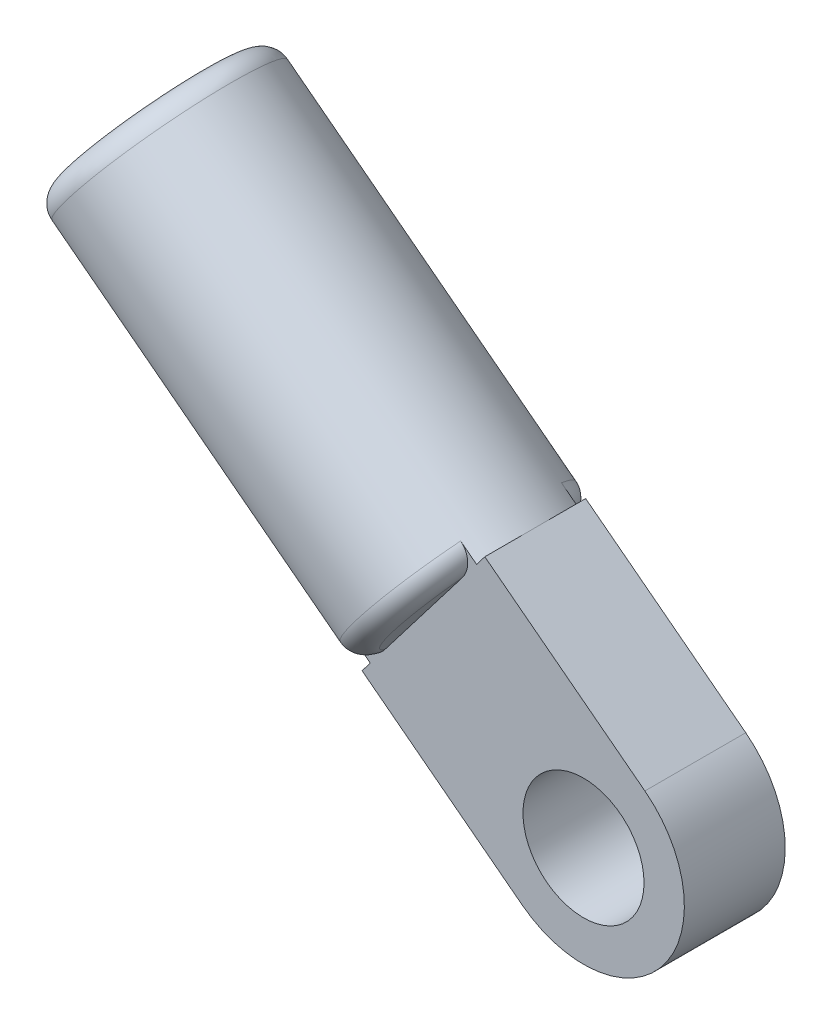
ISO-10303-21;
HEADER;
FILE_DESCRIPTION(('STEP AP214'),'2;1');
FILE_NAME('part.step','',(''),(''),'','','');
FILE_SCHEMA(('AUTOMOTIVE_DESIGN { 1 0 10303 214 1 1 1 1 }'));
ENDSEC;
DATA;
#1=APPLICATION_CONTEXT('core data for automotive mechanical design processes');
#2=APPLICATION_PROTOCOL_DEFINITION('international standard','automotive_design',2000,#1);
#3=PRODUCT_CONTEXT('',#1,'mechanical');
#4=PRODUCT('Part','Part','',(#3));
#5=PRODUCT_RELATED_PRODUCT_CATEGORY('part','',(#4));
#6=PRODUCT_DEFINITION_FORMATION('','',#4);
#7=PRODUCT_DEFINITION_CONTEXT('part definition',#1,'design');
#8=PRODUCT_DEFINITION('design','',#6,#7);
#9=PRODUCT_DEFINITION_SHAPE('','',#8);
#10=(LENGTH_UNIT() NAMED_UNIT(*) SI_UNIT(.MILLI.,.METRE.));
#11=(NAMED_UNIT(*) PLANE_ANGLE_UNIT() SI_UNIT($,.RADIAN.));
#12=(NAMED_UNIT(*) SI_UNIT($,.STERADIAN.) SOLID_ANGLE_UNIT());
#13=UNCERTAINTY_MEASURE_WITH_UNIT(LENGTH_MEASURE(1.E-05),#10,'distance_accuracy_value','');
#14=(GEOMETRIC_REPRESENTATION_CONTEXT(3) GLOBAL_UNCERTAINTY_ASSIGNED_CONTEXT((#13)) GLOBAL_UNIT_ASSIGNED_CONTEXT((#10,
#11,#12)) REPRESENTATION_CONTEXT('',''));
#15=CARTESIAN_POINT('',(0.,0.,0.));
#16=DIRECTION('',(0.,0.,1.));
#17=DIRECTION('',(1.,0.,0.));
#18=AXIS2_PLACEMENT_3D('',#15,#16,#17);
#19=CARTESIAN_POINT('',(-2.23785493034824,30.0086299599503,2.5));
#20=DIRECTION('',(0.793491471983616,-0.608581369982088,0.));
#21=DIRECTION('',(0.608581369982088,0.793491471983616,0.));
#22=AXIS2_PLACEMENT_3D('',#19,#20,#21);
#23=PLANE('',#22);
#24=CARTESIAN_POINT('',(-5.28076178025869,26.0411726000322,0.));
#25=DIRECTION('',(-0.793491471983616,0.608581369982088,0.));
#26=DIRECTION('',(-0.608581369982088,-0.793491471983616,0.));
#27=AXIS2_PLACEMENT_3D('',#24,#25,#26);
#28=CIRCLE('',#27,5.);
#29=CARTESIAN_POINT('',(-2.64552714688657,29.4770914621528,2.5));
#30=VERTEX_POINT('',#29);
#31=CARTESIAN_POINT('',(-2.23785493034825,30.0086299599503,0.));
#32=VERTEX_POINT('',#31);
#33=EDGE_CURVE('E133',#30,#32,#28,.T.);
#34=ORIENTED_EDGE('',*,*,#33,.F.);
#35=DIRECTION('',(-0.608581369982088,-0.793491471983616,0.));
#36=VECTOR('',#35,1.);
#37=CARTESIAN_POINT('',(-2.23785493034824,30.0086299599503,2.5));
#38=LINE('',#37,#36);
#39=CARTESIAN_POINT('',(-2.23785493034824,30.0086299599503,2.5));
#40=VERTEX_POINT('',#39);
#41=EDGE_CURVE('E159',#40,#30,#38,.T.);
#42=ORIENTED_EDGE('',*,*,#41,.F.);
#43=DIRECTION('',(0.,0.,-1.));
#44=VECTOR('',#43,1.);
#45=CARTESIAN_POINT('',(-2.23785493034824,30.0086299599503,2.5));
#46=LINE('',#45,#44);
#47=EDGE_CURVE('E141',#40,#32,#46,.T.);
#48=ORIENTED_EDGE('',*,*,#47,.T.);
#49=EDGE_LOOP('',(#34,#42,#48));
#50=FACE_BOUND('',#49,.T.);
#51=ADVANCED_FACE('F17',(#50),#23,.F.);
#52=CARTESIAN_POINT('',(-2.64552714688657,29.4770914621528,-2.5));
#53=VERTEX_POINT('',#52);
#54=EDGE_CURVE('E138',#32,#53,#28,.T.);
#55=ORIENTED_EDGE('',*,*,#54,.F.);
#56=CARTESIAN_POINT('',(-2.23785493034824,30.0086299599503,-2.5));
#57=VERTEX_POINT('',#56);
#58=EDGE_CURVE('E115',#32,#57,#46,.T.);
#59=ORIENTED_EDGE('',*,*,#58,.T.);
#60=DIRECTION('',(-0.608581369982088,-0.793491471983616,0.));
#61=VECTOR('',#60,1.);
#62=CARTESIAN_POINT('',(-2.23785493034824,30.0086299599503,-2.5));
#63=LINE('',#62,#61);
#64=EDGE_CURVE('E169',#57,#53,#63,.T.);
#65=ORIENTED_EDGE('',*,*,#64,.T.);
#66=EDGE_LOOP('',(#55,#59,#65));
#67=FACE_BOUND('',#66,.T.);
#68=ADVANCED_FACE('F241',(#67),#23,.F.);
#69=CARTESIAN_POINT('',(-8.32366863016913,22.0737152401142,0.));
#70=VERTEX_POINT('',#69);
#71=CARTESIAN_POINT('',(-7.91599641363081,22.6052537379116,2.5));
#72=VERTEX_POINT('',#71);
#73=EDGE_CURVE('E126',#70,#72,#28,.T.);
#74=ORIENTED_EDGE('',*,*,#73,.F.);
#75=DIRECTION('',(0.,0.,-1.));
#76=VECTOR('',#75,1.);
#77=CARTESIAN_POINT('',(-8.32366863016913,22.0737152401141,2.5));
#78=LINE('',#77,#76);
#79=CARTESIAN_POINT('',(-8.32366863016913,22.0737152401141,2.5));
#80=VERTEX_POINT('',#79);
#81=EDGE_CURVE('E105',#80,#70,#78,.T.);
#82=ORIENTED_EDGE('',*,*,#81,.F.);
#83=EDGE_CURVE('E128',#72,#80,#38,.T.);
#84=ORIENTED_EDGE('',*,*,#83,.F.);
#85=EDGE_LOOP('',(#74,#82,#84));
#86=FACE_BOUND('',#85,.T.);
#87=ADVANCED_FACE('F127',(#86),#23,.F.);
#88=CARTESIAN_POINT('',(2.65415293957748,19.9553589002113,2.5));
#89=DIRECTION('',(0.,0.,1.));
#90=DIRECTION('',(1.,0.,0.));
#91=AXIS2_PLACEMENT_3D('',#88,#89,#90);
#92=PLANE('',#91);
#93=CARTESIAN_POINT('',(2.65415293957748,19.9553589002113,2.5));
#94=DIRECTION('',(0.,0.,1.));
#95=DIRECTION('',(1.,0.,0.));
#96=AXIS2_PLACEMENT_3D('',#93,#94,#95);
#97=CIRCLE('',#96,5.);
#98=CARTESIAN_POINT('',(-0.388753910332963,15.9879015402932,2.5));
#99=VERTEX_POINT('',#98);
#100=CARTESIAN_POINT('',(5.69705978948792,23.9228162601294,2.5));
#101=VERTEX_POINT('',#100);
#102=EDGE_CURVE('E153',#99,#101,#97,.T.);
#103=ORIENTED_EDGE('',*,*,#102,.T.);
#104=DIRECTION('',(-0.793491471983616,0.608581369982087,0.));
#105=VECTOR('',#104,1.);
#106=CARTESIAN_POINT('',(5.69705978948792,23.9228162601294,2.5));
#107=LINE('',#106,#105);
#108=EDGE_CURVE('E156',#101,#40,#107,.T.);
#109=ORIENTED_EDGE('',*,*,#108,.T.);
#110=ORIENTED_EDGE('',*,*,#41,.T.);
#111=DIRECTION('',(0.793491471983616,-0.608581369982088,0.));
#112=VECTOR('',#111,1.);
#113=CARTESIAN_POINT('',(-3.43901861887018,30.0856728321349,2.5));
#114=LINE('',#113,#112);
#115=CARTESIAN_POINT('',(-3.43901861887018,30.0856728321349,2.5));
#116=VERTEX_POINT('',#115);
#117=EDGE_CURVE('E188',#116,#30,#114,.T.);
#118=ORIENTED_EDGE('',*,*,#117,.F.);
#119=CARTESIAN_POINT('',(-3.43901861887018,30.0856728321349,2.5));
#120=CARTESIAN_POINT('',(-3.41896955500238,30.0702975440747,2.5));
#121=CARTESIAN_POINT('',(-3.39960582898218,30.0540500670294,2.5));
#122=CARTESIAN_POINT('',(-3.36237130941455,30.0199356886292,2.5));
#123=CARTESIAN_POINT('',(-3.34450010773783,30.0020692327872,2.5));
#124=CARTESIAN_POINT('',(-3.29345022601528,29.9463872431567,2.5));
#125=CARTESIAN_POINT('',(-3.26264807727826,29.9063448475991,2.5));
#126=CARTESIAN_POINT('',(-3.20823323073214,29.8217239007348,2.5));
#127=CARTESIAN_POINT('',(-3.18461630730344,29.7771480362169,2.5));
#128=CARTESIAN_POINT('',(-3.14484094522739,29.6847686194062,2.5));
#129=CARTESIAN_POINT('',(-3.12868714968708,29.6369630789435,2.5));
#130=CARTESIAN_POINT('',(-3.10332312703581,29.5373683370003,2.5));
#131=CARTESIAN_POINT('',(-3.09444160022297,29.4854962345447,2.5));
#132=CARTESIAN_POINT('',(-3.08449541453531,29.3810255682005,2.5));
#133=CARTESIAN_POINT('',(-3.08343306687866,29.3284267941223,2.5));
#134=CARTESIAN_POINT('',(-3.08892837430302,29.21714466514,2.5));
#135=CARTESIAN_POINT('',(-3.09644046466107,29.158509633706,2.5));
#136=CARTESIAN_POINT('',(-3.11977481177393,29.0429151213898,2.5));
#137=CARTESIAN_POINT('',(-3.13560375370714,28.9859570274,2.5));
#138=CARTESIAN_POINT('',(-3.17785062390156,28.8654079522634,2.5));
#139=CARTESIAN_POINT('',(-3.20558858653203,28.8022818776523,2.5));
#140=CARTESIAN_POINT('',(-3.26956318213,28.680596282653,2.5));
#141=CARTESIAN_POINT('',(-3.30579278820438,28.6220330395928,2.5));
#142=CARTESIAN_POINT('',(-3.35692736919442,28.5501155032437,2.5));
#143=CARTESIAN_POINT('',(-3.36856054223503,28.5343725595084,2.5));
#144=CARTESIAN_POINT('',(-3.38046706155834,28.5188489271742,2.5));
#145=B_SPLINE_CURVE_WITH_KNOTS('',3,(#119,#120,#121,#122,#123,#124,#125,#126,#127,#128,#129,
#130,#131,#132,#133,#134,#135,#136,#137,#138,#139,#140,#141,#142,#143,#144),.UNSPECIFIED.,.F.,
.F.,(4,2,2,2,2,2,2,2,2,2,2,2,4),(0.,0.0757479300215003,0.151475078560445,0.302230036867802,
0.452896164278266,0.603655901237656,0.76090298325177,0.918196542999334,1.09485921720864,
1.27166411258765,1.47776711850203,1.68370017118494,1.74240843576739),.UNSPECIFIED.);
#146=CARTESIAN_POINT('',(-3.38046706155834,28.5188489271742,2.5));
#147=VERTEX_POINT('',#146);
#148=EDGE_CURVE('E30',#116,#147,#145,.T.);
#149=ORIENTED_EDGE('',*,*,#148,.T.);
#150=CARTESIAN_POINT('',(-7.18105649895903,23.5634962728902,2.5));
#151=VERTEX_POINT('',#150);
#152=EDGE_CURVE('E162',#147,#151,#38,.T.);
#153=ORIENTED_EDGE('',*,*,#152,.T.);
#154=CARTESIAN_POINT('',(-7.18105649895904,23.5634962728902,2.5));
#155=CARTESIAN_POINT('',(-7.20681159722684,23.5299259211535,2.5));
#156=CARTESIAN_POINT('',(-7.23384721102593,23.497357969233,2.5));
#157=CARTESIAN_POINT('',(-7.29051258337379,23.4344804283726,2.5));
#158=CARTESIAN_POINT('',(-7.32014606773848,23.4041742023161,2.5));
#159=CARTESIAN_POINT('',(-7.41314722181215,23.3169171947573,2.5));
#160=CARTESIAN_POINT('',(-7.48038813950615,23.2639299702253,2.5));
#161=CARTESIAN_POINT('',(-7.60728251022454,23.182525693166,2.5));
#162=CARTESIAN_POINT('',(-7.66512134287509,23.1512605033528,2.5));
#163=CARTESIAN_POINT('',(-7.78506830901948,23.0986348243856,2.5));
#164=CARTESIAN_POINT('',(-7.8471667004734,23.0772525458978,2.5));
#165=CARTESIAN_POINT('',(-7.97478598317975,23.0457908781078,2.5));
#166=CARTESIAN_POINT('',(-8.04033161213205,23.0358097651425,2.5));
#167=CARTESIAN_POINT('',(-8.17218853809744,23.0289289562247,2.5));
#168=CARTESIAN_POINT('',(-8.23849973050852,23.0320274937573,2.5));
#169=CARTESIAN_POINT('',(-8.35990801844867,23.050727463476,2.5));
#170=CARTESIAN_POINT('',(-8.4152842363117,23.0645340221083,2.5));
#171=CARTESIAN_POINT('',(-8.52233441596383,23.1024301331514,2.5));
#172=CARTESIAN_POINT('',(-8.57401757942675,23.126493007587,2.5));
#173=CARTESIAN_POINT('',(-8.63782445909425,23.1641764111498,2.5));
#174=CARTESIAN_POINT('',(-8.65258619737891,23.1735088466028,2.5));
#175=CARTESIAN_POINT('',(-8.68149793298264,23.1930328071648,2.5));
#176=CARTESIAN_POINT('',(-8.69564881585631,23.2032230208324,2.5));
#177=CARTESIAN_POINT('',(-8.70948788561447,23.2138351078937,2.5));
#178=B_SPLINE_CURVE_WITH_KNOTS('',3,(#154,#155,#156,#157,#158,#159,#160,#161,#162,#163,#164,
#165,#166,#167,#168,#169,#170,#171,#172,#173,#174,#175,#176,#177),.UNSPECIFIED.,.F.,.F.,(4,2,2,
2,2,2,2,2,2,2,2,4),(0.,0.126863989200423,0.253912997755041,0.509131336416489,0.70562002702799,
0.901673418417656,1.0994043018414,1.29710848093036,1.46737461793752,1.63720054828405,
1.68957120174348,1.7418631924309),.UNSPECIFIED.);
#179=CARTESIAN_POINT('',(-8.70948788561443,23.2138351078937,2.5));
#180=VERTEX_POINT('',#179);
#181=EDGE_CURVE('E11',#151,#180,#178,.T.);
#182=ORIENTED_EDGE('',*,*,#181,.T.);
#183=DIRECTION('',(0.793491471983616,-0.608581369982088,0.));
#184=VECTOR('',#183,1.);
#185=CARTESIAN_POINT('',(-7.91599641363081,22.6052537379116,2.5));
#186=LINE('',#185,#184);
#187=EDGE_CURVE('E36',#72,#180,#186,.F.);
#188=ORIENTED_EDGE('',*,*,#187,.F.);
#189=ORIENTED_EDGE('',*,*,#83,.T.);
#190=DIRECTION('',(0.793491471983616,-0.608581369982088,0.));
#191=VECTOR('',#190,1.);
#192=CARTESIAN_POINT('',(-8.32366863016913,22.0737152401141,2.5));
#193=LINE('',#192,#191);
#194=EDGE_CURVE('E111',#80,#99,#193,.T.);
#195=ORIENTED_EDGE('',*,*,#194,.T.);
#196=EDGE_LOOP('',(#103,#109,#110,#118,#149,#153,#182,#188,#189,#195));
#197=FACE_BOUND('',#196,.T.);
#198=CARTESIAN_POINT('',(2.65415293957748,19.9553589002113,2.5));
#199=DIRECTION('',(0.,0.,1.));
#200=DIRECTION('',(1.,0.,0.));
#201=AXIS2_PLACEMENT_3D('',#198,#199,#200);
#202=CIRCLE('',#201,3.);
#203=CARTESIAN_POINT('',(5.65415293957748,19.9553589002113,2.5));
#204=VERTEX_POINT('',#203);
#205=EDGE_CURVE('E147',#204,#204,#202,.T.);
#206=ORIENTED_EDGE('',*,*,#205,.F.);
#207=EDGE_LOOP('',(#206));
#208=FACE_BOUND('',#207,.T.);
#209=ADVANCED_FACE('F252',(#197,#208),#92,.T.);
#210=CARTESIAN_POINT('',(2.65415293957748,19.9553589002113,-2.5));
#211=DIRECTION('',(0.,0.,1.));
#212=DIRECTION('',(1.,0.,0.));
#213=AXIS2_PLACEMENT_3D('',#210,#211,#212);
#214=PLANE('',#213);
#215=CARTESIAN_POINT('',(2.65415293957748,19.9553589002113,-2.5));
#216=DIRECTION('',(0.,0.,1.));
#217=DIRECTION('',(1.,0.,0.));
#218=AXIS2_PLACEMENT_3D('',#215,#216,#217);
#219=CIRCLE('',#218,5.);
#220=CARTESIAN_POINT('',(-0.388753910332963,15.9879015402932,-2.5));
#221=VERTEX_POINT('',#220);
#222=CARTESIAN_POINT('',(5.69705978948792,23.9228162601294,-2.5));
#223=VERTEX_POINT('',#222);
#224=EDGE_CURVE('E150',#221,#223,#219,.T.);
#225=ORIENTED_EDGE('',*,*,#224,.F.);
#226=DIRECTION('',(0.793491471983616,-0.608581369982088,0.));
#227=VECTOR('',#226,1.);
#228=CARTESIAN_POINT('',(-8.32366863016913,22.0737152401141,-2.5));
#229=LINE('',#228,#227);
#230=CARTESIAN_POINT('',(-8.32366863016913,22.0737152401141,-2.5));
#231=VERTEX_POINT('',#230);
#232=EDGE_CURVE('E157',#231,#221,#229,.T.);
#233=ORIENTED_EDGE('',*,*,#232,.F.);
#234=CARTESIAN_POINT('',(-7.91599641363081,22.6052537379116,-2.5));
#235=VERTEX_POINT('',#234);
#236=EDGE_CURVE('E123',#235,#231,#63,.T.);
#237=ORIENTED_EDGE('',*,*,#236,.F.);
#238=DIRECTION('',(0.793491471983616,-0.608581369982088,0.));
#239=VECTOR('',#238,1.);
#240=CARTESIAN_POINT('',(-8.70948788561443,23.2138351078937,-2.5));
#241=LINE('',#240,#239);
#242=CARTESIAN_POINT('',(-8.70948788561443,23.2138351078937,-2.5));
#243=VERTEX_POINT('',#242);
#244=EDGE_CURVE('E137',#243,#235,#241,.T.);
#245=ORIENTED_EDGE('',*,*,#244,.F.);
#246=CARTESIAN_POINT('',(-8.70948788561443,23.2138351078937,-2.5));
#247=CARTESIAN_POINT('',(-8.68944043667874,23.1984577142238,-2.5));
#248=CARTESIAN_POINT('',(-8.66872829935256,23.1839683469807,-2.5));
#249=CARTESIAN_POINT('',(-8.62612702517444,23.1568513467878,-2.5));
#250=CARTESIAN_POINT('',(-8.60423821279188,23.1442232041608,-2.5));
#251=CARTESIAN_POINT('',(-8.53722502634709,23.109354776671,-2.5));
#252=CARTESIAN_POINT('',(-8.49056606421203,23.0899870958266,-2.5));
#253=CARTESIAN_POINT('',(-8.39473100186396,23.0593713972787,-2.5));
#254=CARTESIAN_POINT('',(-8.34555640105033,23.048118601867,-2.5));
#255=CARTESIAN_POINT('',(-8.24602353954091,23.0336532792535,-2.5));
#256=CARTESIAN_POINT('',(-8.1956645624142,23.0304457518507,-2.5));
#257=CARTESIAN_POINT('',(-8.09289932718933,23.0317696464739,-2.5));
#258=CARTESIAN_POINT('',(-8.0404982206405,23.0366400226549,-2.5));
#259=CARTESIAN_POINT('',(-7.93702096620401,23.054118711119,-2.5));
#260=CARTESIAN_POINT('',(-7.88594521451407,23.0667293100889,-2.5));
#261=CARTESIAN_POINT('',(-7.77989271509254,23.1008874423707,-2.5));
#262=CARTESIAN_POINT('',(-7.72521008300651,23.1233442489324,-2.5));
#263=CARTESIAN_POINT('',(-7.61961755178888,23.1758494904219,-2.5));
#264=CARTESIAN_POINT('',(-7.56871072531167,23.2059040223879,-2.5));
#265=CARTESIAN_POINT('',(-7.46323624859727,23.2779596420115,-2.5));
#266=CARTESIAN_POINT('',(-7.40945983765068,23.3211150992839,-2.5));
#267=CARTESIAN_POINT('',(-7.308520774968,23.414450186668,-2.5));
#268=CARTESIAN_POINT('',(-7.2613527060702,23.4646239952786,-2.5));
#269=CARTESIAN_POINT('',(-7.20515117600934,23.5326553514782,-2.5));
#270=CARTESIAN_POINT('',(-7.19296249757582,23.5479722411915,-2.5));
#271=CARTESIAN_POINT('',(-7.18105649895904,23.5634962728902,-2.5));
#272=B_SPLINE_CURVE_WITH_KNOTS('',3,(#246,#247,#248,#249,#250,#251,#252,#253,#254,#255,#256,
#257,#258,#259,#260,#261,#262,#263,#264,#265,#266,#267,#268,#269,#270,#271),.UNSPECIFIED.,.F.,
.F.,(4,2,2,2,2,2,2,2,2,2,2,2,4),(0.,0.0757479300215038,0.151475078560448,0.3022300368678,
0.452896164278267,0.603655901237665,0.760902983251768,0.918196542999325,1.09485921720864,
1.27166411258765,1.47776711850201,1.68370017118491,1.74240843576737),.UNSPECIFIED.);
#273=CARTESIAN_POINT('',(-7.18105649895903,23.5634962728902,-2.5));
#274=VERTEX_POINT('',#273);
#275=EDGE_CURVE('E198',#243,#274,#272,.T.);
#276=ORIENTED_EDGE('',*,*,#275,.T.);
#277=CARTESIAN_POINT('',(-3.38046706155834,28.5188489271742,-2.5));
#278=VERTEX_POINT('',#277);
#279=EDGE_CURVE('E172',#278,#274,#63,.T.);
#280=ORIENTED_EDGE('',*,*,#279,.F.);
#281=CARTESIAN_POINT('',(-3.38046706155834,28.5188489271742,-2.5));
#282=CARTESIAN_POINT('',(-3.35472173939887,28.5524267768584,-2.5));
#283=CARTESIAN_POINT('',(-3.33027652642442,28.5869814794099,-2.5));
#284=CARTESIAN_POINT('',(-3.28423979738988,28.6580108335374,-2.5));
#285=CARTESIAN_POINT('',(-3.26265249517568,28.6944882116846,-2.5));
#286=CARTESIAN_POINT('',(-3.20249019743925,28.8069315216601,-2.5));
#287=CARTESIAN_POINT('',(-3.16874740628185,28.8856106867601,-2.5));
#288=CARTESIAN_POINT('',(-3.12302479228841,29.0292709812509,-2.5));
#289=CARTESIAN_POINT('',(-3.10782376113409,29.0932379360657,-2.5));
#290=CARTESIAN_POINT('',(-3.08809458845123,29.2227273044294,-2.5));
#291=CARTESIAN_POINT('',(-3.08354287690803,29.2882459580826,-2.5));
#292=CARTESIAN_POINT('',(-3.08624318600258,29.4196583859173,-2.5));
#293=CARTESIAN_POINT('',(-3.09359653617033,29.4855505731028,-2.5));
#294=CARTESIAN_POINT('',(-3.12113588216848,29.6146829814223,-2.5));
#295=CARTESIAN_POINT('',(-3.1413201447654,29.677923559513,-2.5));
#296=CARTESIAN_POINT('',(-3.19085673085438,29.7903325799993,-2.5));
#297=CARTESIAN_POINT('',(-3.21854791519257,29.8402359353577,-2.5));
#298=CARTESIAN_POINT('',(-3.28290184673462,29.9338010340367,-2.5));
#299=CARTESIAN_POINT('',(-3.31954121373228,29.9774785808732,-2.5));
#300=CARTESIAN_POINT('',(-3.37247856371936,30.0293340894843,-2.5));
#301=CARTESIAN_POINT('',(-3.3853189972743,30.0411715949137,-2.5));
#302=CARTESIAN_POINT('',(-3.411670981873,30.0640330559203,-2.5));
#303=CARTESIAN_POINT('',(-3.42518149590244,30.0750582067744,-2.5));
#304=CARTESIAN_POINT('',(-3.43901861887012,30.085672832135,-2.5));
#305=B_SPLINE_CURVE_WITH_KNOTS('',3,(#281,#282,#283,#284,#285,#286,#287,#288,#289,#290,#291,
#292,#293,#294,#295,#296,#297,#298,#299,#300,#301,#302,#303,#304),.UNSPECIFIED.,.F.,.F.,(4,2,2,
2,2,2,2,2,2,2,2,4),(0.,0.12686398920044,0.253912997755063,0.509131336416514,0.705620027028007,
0.901673418417672,1.09940430184143,1.2971084809304,1.46737461793755,1.63720054828407,
1.68957120174348,1.7418631924309),.UNSPECIFIED.);
#306=CARTESIAN_POINT('',(-3.43901861887018,30.0856728321349,-2.5));
#307=VERTEX_POINT('',#306);
#308=EDGE_CURVE('E204',#278,#307,#305,.T.);
#309=ORIENTED_EDGE('',*,*,#308,.T.);
#310=DIRECTION('',(0.793491471983616,-0.608581369982088,0.));
#311=VECTOR('',#310,1.);
#312=CARTESIAN_POINT('',(-2.64552714688657,29.4770914621528,-2.5));
#313=LINE('',#312,#311);
#314=EDGE_CURVE('E44',#53,#307,#313,.F.);
#315=ORIENTED_EDGE('',*,*,#314,.F.);
#316=ORIENTED_EDGE('',*,*,#64,.F.);
#317=DIRECTION('',(-0.793491471983616,0.608581369982087,0.));
#318=VECTOR('',#317,1.);
#319=CARTESIAN_POINT('',(5.69705978948792,23.9228162601294,-2.5));
#320=LINE('',#319,#318);
#321=EDGE_CURVE('E166',#223,#57,#320,.T.);
#322=ORIENTED_EDGE('',*,*,#321,.F.);
#323=EDGE_LOOP('',(#225,#233,#237,#245,#276,#280,#309,#315,#316,#322));
#324=FACE_BOUND('',#323,.T.);
#325=CARTESIAN_POINT('',(2.65415293957748,19.9553589002113,-2.5));
#326=DIRECTION('',(0.,0.,1.));
#327=DIRECTION('',(1.,0.,0.));
#328=AXIS2_PLACEMENT_3D('',#325,#326,#327);
#329=CIRCLE('',#328,3.);
#330=CARTESIAN_POINT('',(5.65415293957748,19.9553589002113,-2.5));
#331=VERTEX_POINT('',#330);
#332=EDGE_CURVE('E130',#331,#331,#329,.T.);
#333=ORIENTED_EDGE('',*,*,#332,.T.);
#334=EDGE_LOOP('',(#333));
#335=FACE_BOUND('',#334,.T.);
#336=ADVANCED_FACE('F208',(#324,#335),#214,.F.);
#337=CARTESIAN_POINT('',(2.65415293957748,19.9553589002113,2.5));
#338=DIRECTION('',(0.,0.,-1.));
#339=DIRECTION('',(-1.,0.,0.));
#340=AXIS2_PLACEMENT_3D('',#337,#338,#339);
#341=CYLINDRICAL_SURFACE('',#340,5.);
#342=ORIENTED_EDGE('',*,*,#224,.T.);
#343=DIRECTION('',(0.,0.,-1.));
#344=VECTOR('',#343,1.);
#345=CARTESIAN_POINT('',(5.69705978948792,23.9228162601294,2.5));
#346=LINE('',#345,#344);
#347=EDGE_CURVE('E139',#101,#223,#346,.T.);
#348=ORIENTED_EDGE('',*,*,#347,.F.);
#349=ORIENTED_EDGE('',*,*,#102,.F.);
#350=DIRECTION('',(0.,0.,-1.));
#351=VECTOR('',#350,1.);
#352=CARTESIAN_POINT('',(-0.388753910332963,15.9879015402932,2.5));
#353=LINE('',#352,#351);
#354=EDGE_CURVE('E125',#99,#221,#353,.T.);
#355=ORIENTED_EDGE('',*,*,#354,.T.);
#356=EDGE_LOOP('',(#342,#348,#349,#355));
#357=FACE_BOUND('',#356,.T.);
#358=ADVANCED_FACE('F222',(#357),#341,.T.);
#359=CARTESIAN_POINT('',(5.69705978948792,23.9228162601294,2.5));
#360=DIRECTION('',(-0.608581369982087,-0.793491471983616,0.));
#361=DIRECTION('',(0.793491471983616,-0.608581369982088,0.));
#362=AXIS2_PLACEMENT_3D('',#359,#360,#361);
#363=PLANE('',#362);
#364=ORIENTED_EDGE('',*,*,#321,.T.);
#365=ORIENTED_EDGE('',*,*,#58,.F.);
#366=ORIENTED_EDGE('',*,*,#47,.F.);
#367=ORIENTED_EDGE('',*,*,#108,.F.);
#368=ORIENTED_EDGE('',*,*,#347,.T.);
#369=EDGE_LOOP('',(#364,#365,#366,#367,#368));
#370=FACE_BOUND('',#369,.T.);
#371=ADVANCED_FACE('F225',(#370),#363,.F.);
#372=EDGE_CURVE('E121',#235,#70,#28,.T.);
#373=ORIENTED_EDGE('',*,*,#372,.F.);
#374=ORIENTED_EDGE('',*,*,#236,.T.);
#375=EDGE_CURVE('E108',#70,#231,#78,.T.);
#376=ORIENTED_EDGE('',*,*,#375,.F.);
#377=EDGE_LOOP('',(#373,#374,#376));
#378=FACE_BOUND('',#377,.T.);
#379=ADVANCED_FACE('F119',(#378),#23,.F.);
#380=CARTESIAN_POINT('',(-8.32366863016913,22.0737152401141,2.5));
#381=DIRECTION('',(0.608581369982088,0.793491471983616,0.));
#382=DIRECTION('',(-0.793491471983616,0.608581369982088,0.));
#383=AXIS2_PLACEMENT_3D('',#380,#381,#382);
#384=PLANE('',#383);
#385=ORIENTED_EDGE('',*,*,#232,.T.);
#386=ORIENTED_EDGE('',*,*,#354,.F.);
#387=ORIENTED_EDGE('',*,*,#194,.F.);
#388=ORIENTED_EDGE('',*,*,#81,.T.);
#389=ORIENTED_EDGE('',*,*,#375,.T.);
#390=EDGE_LOOP('',(#385,#386,#387,#388,#389));
#391=FACE_BOUND('',#390,.T.);
#392=ADVANCED_FACE('F107',(#391),#384,.F.);
#393=CARTESIAN_POINT('',(2.65415293957748,19.9553589002113,2.5));
#394=DIRECTION('',(0.,0.,-1.));
#395=DIRECTION('',(-1.,0.,0.));
#396=AXIS2_PLACEMENT_3D('',#393,#394,#395);
#397=CYLINDRICAL_SURFACE('',#396,3.);
#398=ORIENTED_EDGE('',*,*,#205,.T.);
#399=EDGE_LOOP('',(#398));
#400=FACE_BOUND('',#399,.T.);
#401=ORIENTED_EDGE('',*,*,#332,.F.);
#402=EDGE_LOOP('',(#401));
#403=FACE_BOUND('',#402,.T.);
#404=ADVANCED_FACE('F232',(#400,#403),#397,.F.);
#405=CARTESIAN_POINT('',(-15.9003089825806,12.1950041877163,0.));
#406=DIRECTION('',(-0.793491471983616,0.608581369982088,0.));
#407=DIRECTION('',(-0.608581369982088,-0.793491471983616,0.));
#408=AXIS2_PLACEMENT_3D('',#405,#406,#407);
#409=PLANE('',#408);
#410=ORIENTED_EDGE('',*,*,#279,.T.);
#411=CARTESIAN_POINT('',(-5.28076178025869,26.0411726000322,0.));
#412=DIRECTION('',(-0.793491471983616,0.608581369982088,0.));
#413=DIRECTION('',(-0.608581369982088,-0.793491471983616,0.));
#414=AXIS2_PLACEMENT_3D('',#411,#412,#413);
#415=CIRCLE('',#414,4.);
#416=EDGE_CURVE('E194',#274,#278,#415,.F.);
#417=ORIENTED_EDGE('',*,*,#416,.T.);
#418=EDGE_LOOP('',(#410,#417));
#419=FACE_BOUND('',#418,.T.);
#420=ADVANCED_FACE('F237',(#419),#409,.F.);
#421=CARTESIAN_POINT('',(-21.150591219931,38.2127999996739,0.));
#422=DIRECTION('',(0.793491471983616,-0.608581369982088,0.));
#423=DIRECTION('',(0.608581369982088,0.793491471983616,0.));
#424=AXIS2_PLACEMENT_3D('',#421,#422,#423);
#425=CYLINDRICAL_SURFACE('',#424,5.);
#426=CARTESIAN_POINT('',(-20.3570997479474,37.6042186296919,0.));
#427=DIRECTION('',(-0.793491471983616,0.608581369982088,0.));
#428=DIRECTION('',(-0.608581369982088,-0.793491471983616,0.));
#429=AXIS2_PLACEMENT_3D('',#426,#427,#428);
#430=CIRCLE('',#429,5.);
#431=CARTESIAN_POINT('',(-23.4000065978578,33.6367612697738,0.));
#432=VERTEX_POINT('',#431);
#433=EDGE_CURVE('E181',#432,#432,#430,.F.);
#434=ORIENTED_EDGE('',*,*,#433,.T.);
#435=EDGE_LOOP('',(#434));
#436=FACE_BOUND('',#435,.T.);
#437=CARTESIAN_POINT('',(-6.0742532522423,26.6497539700143,0.));
#438=DIRECTION('',(-0.793491471983616,0.608581369982088,0.));
#439=DIRECTION('',(-0.608581369982088,-0.793491471983616,0.));
#440=AXIS2_PLACEMENT_3D('',#437,#438,#439);
#441=CIRCLE('',#440,5.);
#442=EDGE_CURVE('E191',#307,#243,#441,.T.);
#443=ORIENTED_EDGE('',*,*,#442,.T.);
#444=ORIENTED_EDGE('',*,*,#244,.T.);
#445=ORIENTED_EDGE('',*,*,#372,.T.);
#446=ORIENTED_EDGE('',*,*,#73,.T.);
#447=ORIENTED_EDGE('',*,*,#187,.T.);
#448=CARTESIAN_POINT('',(-6.0742532522423,26.6497539700143,0.));
#449=DIRECTION('',(-0.793491471983616,0.608581369982088,0.));
#450=DIRECTION('',(-0.608581369982088,-0.793491471983616,0.));
#451=AXIS2_PLACEMENT_3D('',#448,#449,#450);
#452=CIRCLE('',#451,5.);
#453=EDGE_CURVE('E185',#180,#116,#452,.T.);
#454=ORIENTED_EDGE('',*,*,#453,.T.);
#455=ORIENTED_EDGE('',*,*,#117,.T.);
#456=ORIENTED_EDGE('',*,*,#33,.T.);
#457=ORIENTED_EDGE('',*,*,#54,.T.);
#458=ORIENTED_EDGE('',*,*,#314,.T.);
#459=EDGE_LOOP('',(#443,#444,#445,#446,#447,#454,#455,#456,#457,#458));
#460=FACE_BOUND('',#459,.T.);
#461=ADVANCED_FACE('F135',(#436,#460),#425,.T.);
#462=CARTESIAN_POINT('',(-31.7701384222529,24.3666315873581,0.));
#463=DIRECTION('',(-0.793491471983616,0.608581369982088,0.));
#464=DIRECTION('',(-0.608581369982088,-0.793491471983616,0.));
#465=AXIS2_PLACEMENT_3D('',#462,#463,#464);
#466=PLANE('',#465);
#467=CARTESIAN_POINT('',(-21.150591219931,38.2127999996739,0.));
#468=DIRECTION('',(-0.793491471983616,0.608581369982088,0.));
#469=DIRECTION('',(-0.608581369982088,-0.793491471983616,0.));
#470=AXIS2_PLACEMENT_3D('',#467,#468,#469);
#471=CIRCLE('',#470,4.);
#472=CARTESIAN_POINT('',(-23.5849166998594,35.0388341117395,0.));
#473=VERTEX_POINT('',#472);
#474=EDGE_CURVE('E178',#473,#473,#471,.T.);
#475=ORIENTED_EDGE('',*,*,#474,.T.);
#476=EDGE_LOOP('',(#475));
#477=FACE_BOUND('',#476,.T.);
#478=CARTESIAN_POINT('',(-21.150591219931,38.212799999674,0.));
#479=DIRECTION('',(-0.793491471983616,0.608581369982088,0.));
#480=DIRECTION('',(-0.608581369982088,-0.793491471983616,0.));
#481=AXIS2_PLACEMENT_3D('',#478,#479,#480);
#482=CIRCLE('',#481,2.5);
#483=CARTESIAN_POINT('',(-22.6720446448862,36.2290713197149,0.));
#484=VERTEX_POINT('',#483);
#485=EDGE_CURVE('E145',#484,#484,#482,.T.);
#486=ORIENTED_EDGE('',*,*,#485,.F.);
#487=EDGE_LOOP('',(#486));
#488=FACE_BOUND('',#487,.T.);
#489=ADVANCED_FACE('F276',(#477,#488),#466,.T.);
#490=ORIENTED_EDGE('',*,*,#152,.F.);
#491=CARTESIAN_POINT('',(-5.28076178025869,26.0411726000322,0.));
#492=DIRECTION('',(-0.793491471983616,0.608581369982088,0.));
#493=DIRECTION('',(-0.608581369982088,-0.793491471983616,0.));
#494=AXIS2_PLACEMENT_3D('',#491,#492,#493);
#495=CIRCLE('',#494,4.);
#496=EDGE_CURVE('E196',#147,#151,#495,.F.);
#497=ORIENTED_EDGE('',*,*,#496,.T.);
#498=EDGE_LOOP('',(#490,#497));
#499=FACE_BOUND('',#498,.T.);
#500=ADVANCED_FACE('F278',(#499),#409,.F.);
#501=CARTESIAN_POINT('',(-11.6286935561276,30.9098235598889,0.));
#502=DIRECTION('',(-0.793491471983615,0.608581369982088,0.));
#503=DIRECTION('',(-0.608581369982088,-0.793491471983616,0.));
#504=AXIS2_PLACEMENT_3D('',#501,#502,#503);
#505=CYLINDRICAL_SURFACE('',#504,2.5);
#506=CARTESIAN_POINT('',(-11.6286935561276,30.9098235598889,0.));
#507=DIRECTION('',(-0.793491471983616,0.608581369982088,0.));
#508=DIRECTION('',(-0.608581369982088,-0.793491471983616,0.));
#509=AXIS2_PLACEMENT_3D('',#506,#507,#508);
#510=CIRCLE('',#509,2.5);
#511=CARTESIAN_POINT('',(-13.1501469810828,28.9260948799299,0.));
#512=VERTEX_POINT('',#511);
#513=EDGE_CURVE('E131',#512,#512,#510,.T.);
#514=CARTESIAN_POINT('',(-13.1501469810828,28.9260948799299,0.));
#515=CARTESIAN_POINT('',(-13.2493334150808,29.0021675511776,0.));
#516=CARTESIAN_POINT('',(-13.3485198490787,29.0782402224254,0.));
#517=CARTESIAN_POINT('',(-13.5468927170746,29.2303855649209,0.));
#518=CARTESIAN_POINT('',(-13.6460791510726,29.3064582361687,0.));
#519=CARTESIAN_POINT('',(-13.8444520190685,29.4586035786642,0.));
#520=CARTESIAN_POINT('',(-13.9436384530665,29.5346762499119,0.));
#521=CARTESIAN_POINT('',(-14.1420113210624,29.6868215924075,0.));
#522=CARTESIAN_POINT('',(-14.2411977550603,29.7628942636552,0.));
#523=CARTESIAN_POINT('',(-14.4395706230562,29.9150396061508,0.));
#524=CARTESIAN_POINT('',(-14.5387570570542,29.9911122773985,0.));
#525=CARTESIAN_POINT('',(-14.7371299250501,30.143257619894,0.));
#526=CARTESIAN_POINT('',(-14.836316359048,30.2193302911418,0.));
#527=CARTESIAN_POINT('',(-15.0346892270439,30.3714756336373,0.));
#528=CARTESIAN_POINT('',(-15.1338756610419,30.4475483048851,0.));
#529=CARTESIAN_POINT('',(-15.3322485290378,30.5996936473806,0.));
#530=CARTESIAN_POINT('',(-15.4314349630357,30.6757663186284,0.));
#531=CARTESIAN_POINT('',(-15.6298078310316,30.8279116611239,0.));
#532=CARTESIAN_POINT('',(-15.7289942650296,30.9039843323716,0.));
#533=CARTESIAN_POINT('',(-15.9273671330255,31.0561296748672,0.));
#534=CARTESIAN_POINT('',(-16.0265535670234,31.1322023461149,0.));
#535=CARTESIAN_POINT('',(-16.2249264350194,31.2843476886105,0.));
#536=CARTESIAN_POINT('',(-16.3241128690173,31.3604203598582,0.));
#537=CARTESIAN_POINT('',(-16.5224857370132,31.5125657023537,0.));
#538=CARTESIAN_POINT('',(-16.6216721710112,31.5886383736015,0.));
#539=CARTESIAN_POINT('',(-16.8200450390071,31.740783716097,0.));
#540=CARTESIAN_POINT('',(-16.919231473005,31.8168563873448,0.));
#541=CARTESIAN_POINT('',(-17.1176043410009,31.9690017298403,0.));
#542=CARTESIAN_POINT('',(-17.2167907749989,32.0450744010881,0.));
#543=CARTESIAN_POINT('',(-17.4151636429948,32.1972197435836,0.));
#544=CARTESIAN_POINT('',(-17.5143500769927,32.2732924148313,0.));
#545=CARTESIAN_POINT('',(-17.7127229449886,32.4254377573269,0.));
#546=CARTESIAN_POINT('',(-17.8119093789866,32.5015104285746,0.));
#547=CARTESIAN_POINT('',(-18.0102822469825,32.6536557710702,0.));
#548=CARTESIAN_POINT('',(-18.1094686809804,32.7297284423179,0.));
#549=CARTESIAN_POINT('',(-18.3078415489763,32.8818737848134,0.));
#550=CARTESIAN_POINT('',(-18.4070279829743,32.9579464560612,0.));
#551=CARTESIAN_POINT('',(-18.6054008509702,33.1100917985567,0.));
#552=CARTESIAN_POINT('',(-18.7045872849682,33.1861644698045,0.));
#553=CARTESIAN_POINT('',(-18.9029601529641,33.3383098123,0.));
#554=CARTESIAN_POINT('',(-19.002146586962,33.4143824835478,0.));
#555=CARTESIAN_POINT('',(-19.2005194549579,33.5665278260433,0.));
#556=CARTESIAN_POINT('',(-19.2997058889559,33.642600497291,0.));
#557=CARTESIAN_POINT('',(-19.4980787569518,33.7947458397866,0.));
#558=CARTESIAN_POINT('',(-19.5972651909497,33.8708185110343,0.));
#559=CARTESIAN_POINT('',(-19.7956380589456,34.0229638535299,0.));
#560=CARTESIAN_POINT('',(-19.8948244929436,34.0990365247776,0.));
#561=CARTESIAN_POINT('',(-20.0931973609395,34.2511818672731,0.));
#562=CARTESIAN_POINT('',(-20.1923837949374,34.3272545385209,0.));
#563=CARTESIAN_POINT('',(-20.3907566629333,34.4793998810164,0.));
#564=CARTESIAN_POINT('',(-20.4899430969313,34.5554725522642,0.));
#565=CARTESIAN_POINT('',(-20.6883159649272,34.7076178947597,0.));
#566=CARTESIAN_POINT('',(-20.7875023989251,34.7836905660075,0.));
#567=CARTESIAN_POINT('',(-20.9858752669211,34.935835908503,0.));
#568=CARTESIAN_POINT('',(-21.085061700919,35.0119085797507,0.));
#569=CARTESIAN_POINT('',(-21.2834345689149,35.1640539222463,0.));
#570=CARTESIAN_POINT('',(-21.3826210029129,35.240126593494,0.));
#571=CARTESIAN_POINT('',(-21.5809938709088,35.3922719359896,0.));
#572=CARTESIAN_POINT('',(-21.6801803049067,35.4683446072373,0.));
#573=CARTESIAN_POINT('',(-21.8785531729026,35.6204899497328,0.));
#574=CARTESIAN_POINT('',(-21.9777396069006,35.6965626209806,0.));
#575=CARTESIAN_POINT('',(-22.1761124748965,35.8487079634761,0.));
#576=CARTESIAN_POINT('',(-22.2752989088944,35.9247806347239,0.));
#577=CARTESIAN_POINT('',(-22.4736717768903,36.0769259772194,0.));
#578=CARTESIAN_POINT('',(-22.5728582108883,36.1529986484672,0.));
#579=CARTESIAN_POINT('',(-22.6720446448862,36.2290713197149,0.));
#580=B_SPLINE_CURVE_WITH_KNOTS('',3,(#514,#515,#516,#517,#518,#519,#520,#521,#522,#523,#524,
#525,#526,#527,#528,#529,#530,#531,#532,#533,#534,#535,#536,#537,#538,#539,#540,#541,#542,#543,
#544,#545,#546,#547,#548,#549,#550,#551,#552,#553,#554,#555,#556,#557,#558,#559,#560,#561,#562,
#563,#564,#565,#566,#567,#568,#569,#570,#571,#572,#573,#574,#575,#576,#577,#578,#579),
.UNSPECIFIED.,.F.,.F.,(4,2,2,2,2,2,2,2,2,2,2,2,2,2,2,2,2,2,2,2,2,2,2,2,2,2,2,2,2,2,2,2,4),(0.,
0.374999999999999,0.749999999999999,1.125,1.5,1.875,2.25,2.625,3.,3.375,3.75000000000001,
4.12500000000001,4.50000000000001,4.87500000000001,5.25000000000001,5.62500000000001,
6.00000000000001,6.37500000000001,6.75000000000001,7.12500000000002,7.50000000000001,
7.87500000000002,8.25000000000002,8.62500000000002,9.00000000000002,9.37500000000002,
9.75000000000002,10.125,10.5,10.875,11.25,11.625,12.),.UNSPECIFIED.);
#581=EDGE_CURVE('BSEAM281',#512,#484,#580,.T.);
#582=ORIENTED_EDGE('',*,*,#513,.F.);
#583=ORIENTED_EDGE('',*,*,#485,.T.);
#584=ORIENTED_EDGE('',*,*,#581,.T.);
#585=ORIENTED_EDGE('',*,*,#581,.F.);
#586=EDGE_LOOP('',(#582,#584,#583,#585));
#587=FACE_BOUND('',#586,.T.);
#588=ADVANCED_FACE('F281',(#587),#505,.F.);
#589=CARTESIAN_POINT('',(-11.6286935561276,30.9098235598889,0.));
#590=DIRECTION('',(-0.793491471983616,0.608581369982088,0.));
#591=DIRECTION('',(-0.608581369982088,-0.793491471983616,0.));
#592=AXIS2_PLACEMENT_3D('',#589,#590,#591);
#593=PLANE('',#592);
#594=ORIENTED_EDGE('',*,*,#513,.T.);
#595=EDGE_LOOP('',(#594));
#596=FACE_BOUND('',#595,.T.);
#597=ADVANCED_FACE('F220',(#596),#593,.T.);
#598=CARTESIAN_POINT('',(-20.3570997479474,37.6042186296919,0.));
#599=DIRECTION('',(-0.793491471983616,0.608581369982088,0.));
#600=DIRECTION('',(-0.608581369982088,-0.793491471983616,0.));
#601=AXIS2_PLACEMENT_3D('',#598,#599,#600);
#602=TOROIDAL_SURFACE('',#601,4.,1.);
#603=ORIENTED_EDGE('',*,*,#433,.F.);
#604=EDGE_LOOP('',(#603));
#605=FACE_BOUND('',#604,.T.);
#606=ORIENTED_EDGE('',*,*,#474,.F.);
#607=EDGE_LOOP('',(#606));
#608=FACE_BOUND('',#607,.T.);
#609=ADVANCED_FACE('F215',(#605,#608),#602,.T.);
#610=CARTESIAN_POINT('',(-6.0742532522423,26.6497539700143,0.));
#611=DIRECTION('',(-0.793491471983616,0.608581369982088,0.));
#612=DIRECTION('',(-0.608581369982088,-0.793491471983616,0.));
#613=AXIS2_PLACEMENT_3D('',#610,#611,#612);
#614=TOROIDAL_SURFACE('',#613,4.,1.);
#615=ORIENTED_EDGE('',*,*,#308,.F.);
#616=ORIENTED_EDGE('',*,*,#416,.F.);
#617=ORIENTED_EDGE('',*,*,#275,.F.);
#618=ORIENTED_EDGE('',*,*,#442,.F.);
#619=EDGE_LOOP('',(#615,#616,#617,#618));
#620=FACE_BOUND('',#619,.T.);
#621=ADVANCED_FACE('F211',(#620),#614,.T.);
#622=CARTESIAN_POINT('',(-6.0742532522423,26.6497539700143,0.));
#623=DIRECTION('',(-0.793491471983616,0.608581369982088,0.));
#624=DIRECTION('',(-0.608581369982088,-0.793491471983616,0.));
#625=AXIS2_PLACEMENT_3D('',#622,#623,#624);
#626=TOROIDAL_SURFACE('',#625,4.,1.);
#627=ORIENTED_EDGE('',*,*,#181,.F.);
#628=ORIENTED_EDGE('',*,*,#496,.F.);
#629=ORIENTED_EDGE('',*,*,#148,.F.);
#630=ORIENTED_EDGE('',*,*,#453,.F.);
#631=EDGE_LOOP('',(#627,#628,#629,#630));
#632=FACE_BOUND('',#631,.T.);
#633=ADVANCED_FACE('F19',(#632),#626,.T.);
#634=CLOSED_SHELL('',(#51,#68,#87,#209,#336,#358,#371,#379,#392,#404,#420,#461,#489,#500,#588,
#597,#609,#621,#633));
#635=MANIFOLD_SOLID_BREP('B1',#634);
#636=ADVANCED_BREP_SHAPE_REPRESENTATION('',(#18,#635),#14);
#637=SHAPE_DEFINITION_REPRESENTATION(#9,#636);
ENDSEC;
END-ISO-10303-21;
